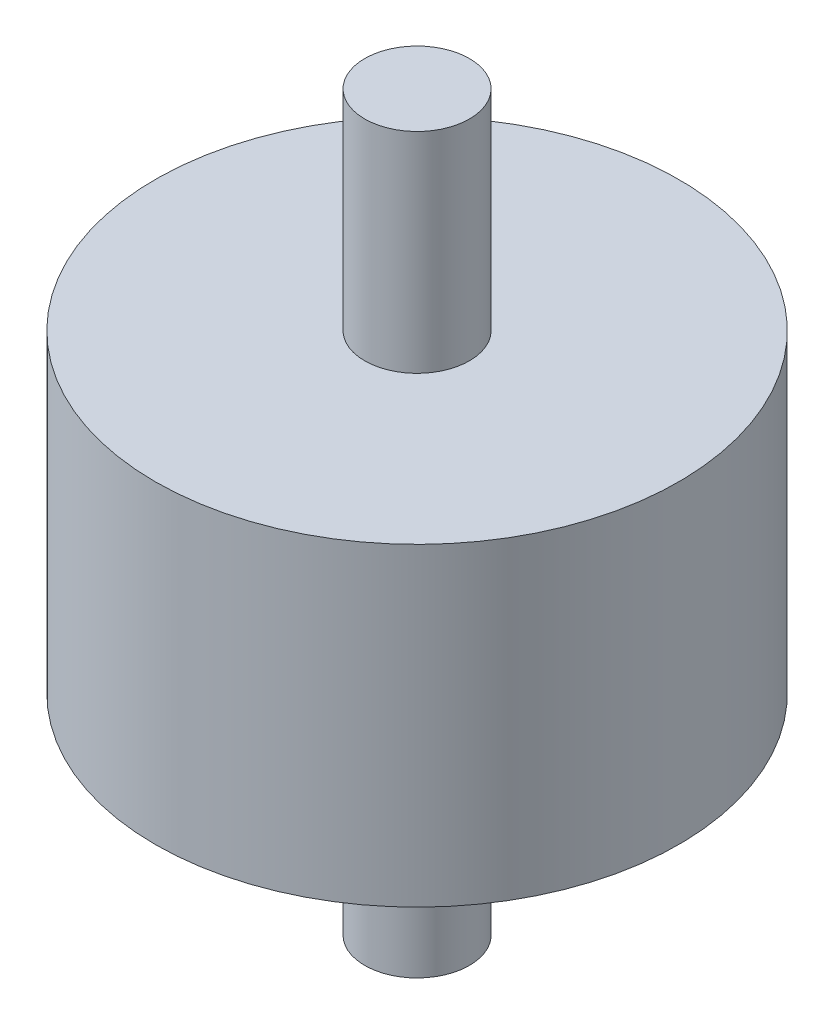
ISO-10303-21;
HEADER;
FILE_DESCRIPTION(('STEP AP214'),'2;1');
FILE_NAME('part.step','',(''),(''),'','','');
FILE_SCHEMA(('AUTOMOTIVE_DESIGN { 1 0 10303 214 1 1 1 1 }'));
ENDSEC;
DATA;
#1=APPLICATION_CONTEXT('core data for automotive mechanical design processes');
#2=APPLICATION_PROTOCOL_DEFINITION('international standard','automotive_design',2000,#1);
#3=PRODUCT_CONTEXT('',#1,'mechanical');
#4=PRODUCT('Part','Part','',(#3));
#5=PRODUCT_RELATED_PRODUCT_CATEGORY('part','',(#4));
#6=PRODUCT_DEFINITION_FORMATION('','',#4);
#7=PRODUCT_DEFINITION_CONTEXT('part definition',#1,'design');
#8=PRODUCT_DEFINITION('design','',#6,#7);
#9=PRODUCT_DEFINITION_SHAPE('','',#8);
#10=(LENGTH_UNIT() NAMED_UNIT(*) SI_UNIT(.MILLI.,.METRE.));
#11=(NAMED_UNIT(*) PLANE_ANGLE_UNIT() SI_UNIT($,.RADIAN.));
#12=(NAMED_UNIT(*) SI_UNIT($,.STERADIAN.) SOLID_ANGLE_UNIT());
#13=UNCERTAINTY_MEASURE_WITH_UNIT(LENGTH_MEASURE(1.E-05),#10,'distance_accuracy_value','');
#14=(GEOMETRIC_REPRESENTATION_CONTEXT(3) GLOBAL_UNCERTAINTY_ASSIGNED_CONTEXT((#13)) GLOBAL_UNIT_ASSIGNED_CONTEXT((#10,
#11,#12)) REPRESENTATION_CONTEXT('',''));
#15=CARTESIAN_POINT('',(0.,0.,0.));
#16=DIRECTION('',(0.,0.,1.));
#17=DIRECTION('',(1.,0.,0.));
#18=AXIS2_PLACEMENT_3D('',#15,#16,#17);
#19=CARTESIAN_POINT('',(0.,3.,0.));
#20=DIRECTION('',(0.,-1.,0.));
#21=DIRECTION('',(0.,0.,-1.));
#22=AXIS2_PLACEMENT_3D('',#19,#20,#21);
#23=CYLINDRICAL_SURFACE('',#22,2.5);
#24=CARTESIAN_POINT('',(0.,3.,0.));
#25=DIRECTION('',(0.,1.,0.));
#26=DIRECTION('',(0.,0.,1.));
#27=AXIS2_PLACEMENT_3D('',#24,#25,#26);
#28=CIRCLE('',#27,2.5);
#29=CARTESIAN_POINT('',(0.,3.,2.5));
#30=VERTEX_POINT('',#29);
#31=EDGE_CURVE('E55',#30,#30,#28,.T.);
#32=ORIENTED_EDGE('',*,*,#31,.F.);
#33=EDGE_LOOP('',(#32));
#34=FACE_BOUND('',#33,.T.);
#35=CARTESIAN_POINT('',(0.,0.,0.));
#36=DIRECTION('',(0.,1.,0.));
#37=DIRECTION('',(0.,0.,1.));
#38=AXIS2_PLACEMENT_3D('',#35,#36,#37);
#39=CIRCLE('',#38,2.5);
#40=CARTESIAN_POINT('',(0.,0.,2.5));
#41=VERTEX_POINT('',#40);
#42=EDGE_CURVE('E44',#41,#41,#39,.T.);
#43=ORIENTED_EDGE('',*,*,#42,.T.);
#44=EDGE_LOOP('',(#43));
#45=FACE_BOUND('',#44,.T.);
#46=ADVANCED_FACE('F41',(#34,#45),#23,.T.);
#47=CARTESIAN_POINT('',(0.,3.,0.));
#48=DIRECTION('',(0.,1.,0.));
#49=DIRECTION('',(0.,0.,1.));
#50=AXIS2_PLACEMENT_3D('',#47,#48,#49);
#51=PLANE('',#50);
#52=CARTESIAN_POINT('',(0.,3.,0.));
#53=DIRECTION('',(0.,1.,0.));
#54=DIRECTION('',(0.,0.,1.));
#55=AXIS2_PLACEMENT_3D('',#52,#53,#54);
#56=CIRCLE('',#55,0.5);
#57=CARTESIAN_POINT('',(0.,3.,0.5));
#58=VERTEX_POINT('',#57);
#59=EDGE_CURVE('E49',#58,#58,#56,.T.);
#60=ORIENTED_EDGE('',*,*,#59,.F.);
#61=EDGE_LOOP('',(#60));
#62=FACE_BOUND('',#61,.T.);
#63=ORIENTED_EDGE('',*,*,#31,.T.);
#64=EDGE_LOOP('',(#63));
#65=FACE_BOUND('',#64,.T.);
#66=ADVANCED_FACE('F75',(#62,#65),#51,.T.);
#67=CARTESIAN_POINT('',(0.,0.,0.));
#68=DIRECTION('',(0.,1.,0.));
#69=DIRECTION('',(0.,0.,1.));
#70=AXIS2_PLACEMENT_3D('',#67,#68,#69);
#71=PLANE('',#70);
#72=CARTESIAN_POINT('',(0.,0.,0.));
#73=DIRECTION('',(0.,-1.,0.));
#74=DIRECTION('',(0.,0.,-1.));
#75=AXIS2_PLACEMENT_3D('',#72,#73,#74);
#76=CIRCLE('',#75,0.5);
#77=CARTESIAN_POINT('',(0.,0.,-0.5));
#78=VERTEX_POINT('',#77);
#79=EDGE_CURVE('E10',#78,#78,#76,.T.);
#80=ORIENTED_EDGE('',*,*,#79,.F.);
#81=EDGE_LOOP('',(#80));
#82=FACE_BOUND('',#81,.T.);
#83=ORIENTED_EDGE('',*,*,#42,.F.);
#84=EDGE_LOOP('',(#83));
#85=FACE_BOUND('',#84,.T.);
#86=ADVANCED_FACE('F72',(#82,#85),#71,.F.);
#87=CARTESIAN_POINT('',(0.,5.,0.));
#88=DIRECTION('',(0.,-1.,0.));
#89=DIRECTION('',(0.,0.,-1.));
#90=AXIS2_PLACEMENT_3D('',#87,#88,#89);
#91=CYLINDRICAL_SURFACE('',#90,0.5);
#92=CARTESIAN_POINT('',(0.,5.,0.));
#93=DIRECTION('',(0.,1.,0.));
#94=DIRECTION('',(0.,0.,1.));
#95=AXIS2_PLACEMENT_3D('',#92,#93,#94);
#96=CIRCLE('',#95,0.5);
#97=CARTESIAN_POINT('',(0.,5.,0.5));
#98=VERTEX_POINT('',#97);
#99=EDGE_CURVE('E60',#98,#98,#96,.T.);
#100=ORIENTED_EDGE('',*,*,#99,.F.);
#101=EDGE_LOOP('',(#100));
#102=FACE_BOUND('',#101,.T.);
#103=ORIENTED_EDGE('',*,*,#59,.T.);
#104=EDGE_LOOP('',(#103));
#105=FACE_BOUND('',#104,.T.);
#106=ADVANCED_FACE('F74',(#102,#105),#91,.T.);
#107=CARTESIAN_POINT('',(0.,5.,0.));
#108=DIRECTION('',(0.,1.,0.));
#109=DIRECTION('',(0.,0.,1.));
#110=AXIS2_PLACEMENT_3D('',#107,#108,#109);
#111=PLANE('',#110);
#112=ORIENTED_EDGE('',*,*,#99,.T.);
#113=EDGE_LOOP('',(#112));
#114=FACE_BOUND('',#113,.T.);
#115=ADVANCED_FACE('F81',(#114),#111,.T.);
#116=CARTESIAN_POINT('',(0.,-2.,0.));
#117=DIRECTION('',(0.,1.,0.));
#118=DIRECTION('',(0.,0.,1.));
#119=AXIS2_PLACEMENT_3D('',#116,#117,#118);
#120=CYLINDRICAL_SURFACE('',#119,0.5);
#121=CARTESIAN_POINT('',(0.,-2.,0.));
#122=DIRECTION('',(0.,-1.,0.));
#123=DIRECTION('',(0.,0.,-1.));
#124=AXIS2_PLACEMENT_3D('',#121,#122,#123);
#125=CIRCLE('',#124,0.5);
#126=CARTESIAN_POINT('',(0.,-2.,-0.5));
#127=VERTEX_POINT('',#126);
#128=EDGE_CURVE('E59',#127,#127,#125,.T.);
#129=ORIENTED_EDGE('',*,*,#128,.F.);
#130=EDGE_LOOP('',(#129));
#131=FACE_BOUND('',#130,.T.);
#132=ORIENTED_EDGE('',*,*,#79,.T.);
#133=EDGE_LOOP('',(#132));
#134=FACE_BOUND('',#133,.T.);
#135=ADVANCED_FACE('F111',(#131,#134),#120,.T.);
#136=CARTESIAN_POINT('',(0.,-2.,0.));
#137=DIRECTION('',(0.,-1.,0.));
#138=DIRECTION('',(0.,0.,-1.));
#139=AXIS2_PLACEMENT_3D('',#136,#137,#138);
#140=PLANE('',#139);
#141=ORIENTED_EDGE('',*,*,#128,.T.);
#142=EDGE_LOOP('',(#141));
#143=FACE_BOUND('',#142,.T.);
#144=ADVANCED_FACE('F127',(#143),#140,.T.);
#145=CLOSED_SHELL('',(#46,#66,#86,#106,#115,#135,#144));
#146=MANIFOLD_SOLID_BREP('B2',#145);
#147=ADVANCED_BREP_SHAPE_REPRESENTATION('',(#18,#146),#14);
#148=SHAPE_DEFINITION_REPRESENTATION(#9,#147);
ENDSEC;
END-ISO-10303-21;
